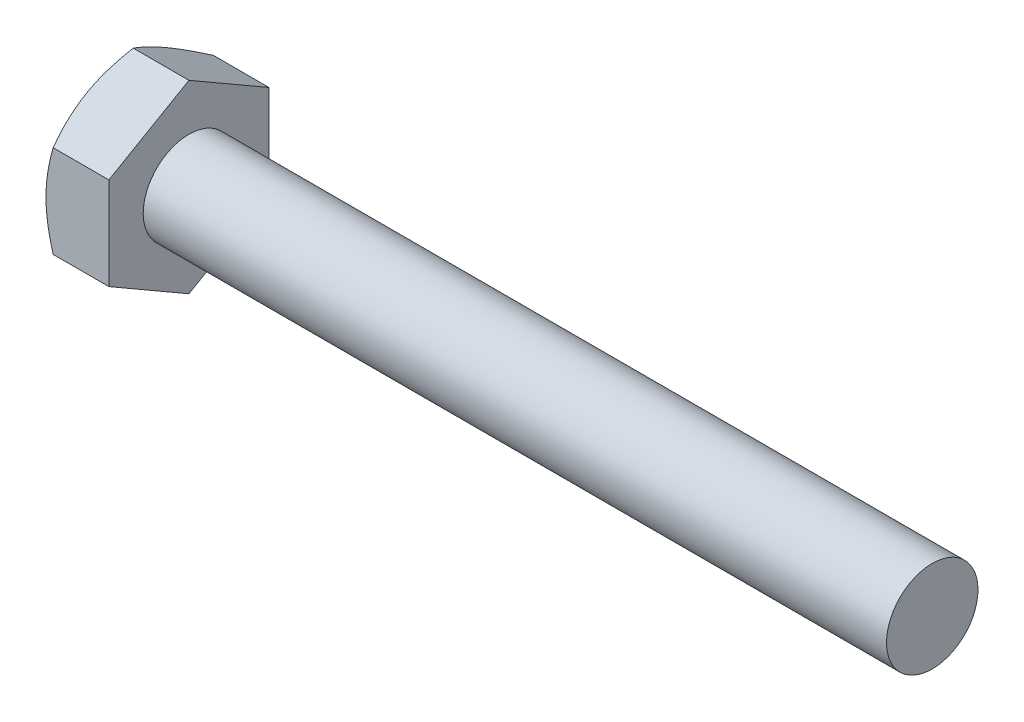
ISO-10303-21;
HEADER;
FILE_DESCRIPTION(('STEP AP214'),'2;1');
FILE_NAME('part.step','',(''),(''),'','','');
FILE_SCHEMA(('AUTOMOTIVE_DESIGN { 1 0 10303 214 1 1 1 1 }'));
ENDSEC;
DATA;
#1=APPLICATION_CONTEXT('core data for automotive mechanical design processes');
#2=APPLICATION_PROTOCOL_DEFINITION('international standard','automotive_design',2000,#1);
#3=PRODUCT_CONTEXT('',#1,'mechanical');
#4=PRODUCT('Part','Part','',(#3));
#5=PRODUCT_RELATED_PRODUCT_CATEGORY('part','',(#4));
#6=PRODUCT_DEFINITION_FORMATION('','',#4);
#7=PRODUCT_DEFINITION_CONTEXT('part definition',#1,'design');
#8=PRODUCT_DEFINITION('design','',#6,#7);
#9=PRODUCT_DEFINITION_SHAPE('','',#8);
#10=(LENGTH_UNIT() NAMED_UNIT(*) SI_UNIT(.MILLI.,.METRE.));
#11=(NAMED_UNIT(*) PLANE_ANGLE_UNIT() SI_UNIT($,.RADIAN.));
#12=(NAMED_UNIT(*) SI_UNIT($,.STERADIAN.) SOLID_ANGLE_UNIT());
#13=UNCERTAINTY_MEASURE_WITH_UNIT(LENGTH_MEASURE(1.E-05),#10,'distance_accuracy_value','');
#14=(GEOMETRIC_REPRESENTATION_CONTEXT(3) GLOBAL_UNCERTAINTY_ASSIGNED_CONTEXT((#13)) GLOBAL_UNIT_ASSIGNED_CONTEXT((#10,
#11,#12)) REPRESENTATION_CONTEXT('',''));
#15=CARTESIAN_POINT('',(0.,0.,0.));
#16=DIRECTION('',(0.,0.,1.));
#17=DIRECTION('',(1.,0.,0.));
#18=AXIS2_PLACEMENT_3D('',#15,#16,#17);
#19=CARTESIAN_POINT('',(-27.9796875,-3.20790243318486,5.55625));
#20=DIRECTION('',(0.,0.,-1.));
#21=DIRECTION('',(0.,1.,0.));
#22=AXIS2_PLACEMENT_3D('',#19,#20,#21);
#23=PLANE('',#22);
#24=CARTESIAN_POINT('',(-25.2062500574615,-8.74399028271725,5.55625));
#25=CARTESIAN_POINT('',(-25.3250226439003,-8.50018624433215,5.55625));
#26=CARTESIAN_POINT('',(-25.4426924877412,-8.25583594838019,5.55625));
#27=CARTESIAN_POINT('',(-25.6752088302931,-7.76575276181024,5.55625));
#28=CARTESIAN_POINT('',(-25.790054907504,-7.52001967143121,5.55625));
#29=CARTESIAN_POINT('',(-26.0168565650906,-7.02567502758555,5.55625));
#30=CARTESIAN_POINT('',(-26.1287940754759,-6.77705515601887,5.55625));
#31=CARTESIAN_POINT('',(-26.3482541438231,-6.27788161359692,5.55625));
#32=CARTESIAN_POINT('',(-26.455776902331,-6.02732803119865,5.55625));
#33=CARTESIAN_POINT('',(-26.668781896146,-5.51539046667092,5.55625));
#34=CARTESIAN_POINT('',(-26.7740727000269,-5.2539264127266,5.55625));
#35=CARTESIAN_POINT('',(-26.9769889851458,-4.72798657849262,5.55625));
#36=CARTESIAN_POINT('',(-27.0746136244234,-4.46351047103703,5.55625));
#37=CARTESIAN_POINT('',(-27.2597282154484,-3.931581690416,5.55625));
#38=CARTESIAN_POINT('',(-27.3472376154158,-3.66413585057299,5.55625));
#39=CARTESIAN_POINT('',(-27.5093974423586,-3.12540698347402,5.55625));
#40=CARTESIAN_POINT('',(-27.584051786064,-2.85412515234024,5.55625));
#41=CARTESIAN_POINT('',(-27.7166111578849,-2.30908269853906,5.55625));
#42=CARTESIAN_POINT('',(-27.7746096690236,-2.03534517245376,5.55625));
#43=CARTESIAN_POINT('',(-27.8706483322196,-1.48429809984413,5.55625));
#44=CARTESIAN_POINT('',(-27.9086906465641,-1.20698894364918,5.55625));
#45=CARTESIAN_POINT('',(-27.9482678026956,-0.791294728945898,5.55625));
#46=CARTESIAN_POINT('',(-27.958533902021,-0.653708209357044,5.55625));
#47=CARTESIAN_POINT('',(-27.973237187288,-0.378228688137566,5.55625));
#48=CARTESIAN_POINT('',(-27.9776749263983,-0.240335716836749,5.55625));
#49=CARTESIAN_POINT('',(-27.9806104775687,0.0355251316508488,5.55625));
#50=CARTESIAN_POINT('',(-27.9791077727923,0.17349301431098,5.55625));
#51=CARTESIAN_POINT('',(-27.9702015100424,0.449228447033497,5.55625));
#52=CARTESIAN_POINT('',(-27.9627981814189,0.586996004673769,5.55625));
#53=CARTESIAN_POINT('',(-27.9383619355163,0.914267817860302,5.55625));
#54=CARTESIAN_POINT('',(-27.9187422237309,1.10358331302688,5.55625));
#55=CARTESIAN_POINT('',(-27.8694018119308,1.48088314390515,5.55625));
#56=CARTESIAN_POINT('',(-27.8396798473206,1.66886730995275,5.55625));
#57=CARTESIAN_POINT('',(-27.7369305513119,2.23056094001761,5.55625));
#58=CARTESIAN_POINT('',(-27.6503356125147,2.60182550045217,5.55625));
#59=CARTESIAN_POINT('',(-27.4992011053987,3.15725729103479,5.55625));
#60=CARTESIAN_POINT('',(-27.4445336113424,3.34427702524158,5.55625));
#61=CARTESIAN_POINT('',(-27.329281052333,3.71650215163137,5.55625));
#62=CARTESIAN_POINT('',(-27.2686959419117,3.90170752986172,5.55625));
#63=CARTESIAN_POINT('',(-27.1426000457604,4.27035971442928,5.55625));
#64=CARTESIAN_POINT('',(-27.0770906550753,4.45380700235122,5.55625));
#65=CARTESIAN_POINT('',(-26.9419409129719,4.81916376783226,5.55625));
#66=CARTESIAN_POINT('',(-26.8723006552842,5.00107328017707,5.55625));
#67=CARTESIAN_POINT('',(-26.6799083948252,5.48965634412821,5.55625));
#68=CARTESIAN_POINT('',(-26.5539222750788,5.79505516029649,5.55625));
#69=CARTESIAN_POINT('',(-26.2945712832958,6.40271511827116,5.55625));
#70=CARTESIAN_POINT('',(-26.1612055993156,6.7049759104509,5.55625));
#71=CARTESIAN_POINT('',(-25.8888381126131,7.30707795631466,5.55625));
#72=CARTESIAN_POINT('',(-25.7498341769931,7.60691824193361,5.55625));
#73=CARTESIAN_POINT('',(-25.4675353632321,8.20455030388993,5.55625));
#74=CARTESIAN_POINT('',(-25.3242406584325,8.50234216238501,5.55625));
#75=CARTESIAN_POINT('',(-25.034062083384,9.09675870347432,5.55625));
#76=CARTESIAN_POINT('',(-24.8871728378226,9.39338075659061,5.55625));
#77=CARTESIAN_POINT('',(-24.5907164750758,9.98528417706331,5.55625));
#78=CARTESIAN_POINT('',(-24.4411493357868,10.2805655333282,5.55625));
#79=CARTESIAN_POINT('',(-23.9893144244542,11.1646418998589,5.55625));
#80=CARTESIAN_POINT('',(-23.6838479994491,11.7518013892495,5.55625));
#81=CARTESIAN_POINT('',(-23.0997429574185,12.8613257589912,5.55625));
#82=CARTESIAN_POINT('',(-22.8216735829024,13.3839917749348,5.55625));
#83=CARTESIAN_POINT('',(-22.2621764266466,14.4275635287064,5.55625));
#84=CARTESIAN_POINT('',(-21.9807484397935,14.9484691565073,5.55625));
#85=CARTESIAN_POINT('',(-21.4163519924016,15.9871873035495,5.55625));
#86=CARTESIAN_POINT('',(-21.1333918337456,16.5050043408021,5.55625));
#87=CARTESIAN_POINT('',(-20.5655648642822,17.5395393833806,5.55625));
#88=CARTESIAN_POINT('',(-20.2806982052306,18.0562574719669,5.55625));
#89=CARTESIAN_POINT('',(-19.99513735051,18.5725892213169,5.55624999999999));
#90=B_SPLINE_CURVE_WITH_KNOTS('',3,(#24,#25,#26,#27,#28,#29,#30,#31,#32,#33,#34,#35,#36,#37,#38,
#39,#40,#41,#42,#43,#44,#45,#46,#47,#48,#49,#50,#51,#52,#53,#54,#55,#56,#57,#58,#59,#60,#61,#62,
#63,#64,#65,#66,#67,#68,#69,#70,#71,#72,#73,#74,#75,#76,#77,#78,#79,#80,#81,#82,#83,#84,#85,#86,
#87,#88,#89),.UNSPECIFIED.,.F.,.F.,(4,2,2,2,2,2,2,2,2,2,2,2,2,2,2,2,2,2,2,2,2,2,2,2,2,2,2,2,2,2,
2,2,4),(0.,0.813597716445731,1.6273161491936,2.44525275827226,3.26315217028694,4.10866348233596,
4.95426752580813,5.79821771718856,6.64191031370899,7.48077064504382,8.31954006567861,
8.73334238532056,9.14710542821066,9.56090447051725,9.97468742974188,10.545356138106,
11.1160963088497,12.258134229421,12.842619474887,13.4271092116055,14.0114339823823,
14.5957454997084,15.5866951993033,16.5777541467498,17.5691915643883,18.5605889831377,
19.5535724737812,20.5465641644216,22.5321054869692,24.3081902186865,26.0843839782317,
27.8546363211013,29.6247493906644),.UNSPECIFIED.);
#91=CARTESIAN_POINT('',(-27.4834232665182,-3.20790243318486,5.55625));
#92=VERTEX_POINT('',#91);
#93=CARTESIAN_POINT('',(-27.9796875,0.,5.55625));
#94=VERTEX_POINT('',#93);
#95=EDGE_CURVE('E282',#92,#94,#90,.T.);
#96=ORIENTED_EDGE('',*,*,#95,.F.);
#97=DIRECTION('',(1.,0.,0.));
#98=VECTOR('',#97,1.);
#99=CARTESIAN_POINT('',(-27.9796875,-3.20790243318486,5.55625));
#100=LINE('',#99,#98);
#101=CARTESIAN_POINT('',(-23.6140625,-3.20790243318486,5.55625));
#102=VERTEX_POINT('',#101);
#103=EDGE_CURVE('E258',#92,#102,#100,.T.);
#104=ORIENTED_EDGE('',*,*,#103,.T.);
#105=DIRECTION('',(0.,1.,0.));
#106=VECTOR('',#105,1.);
#107=CARTESIAN_POINT('',(-23.6140625,-3.20790243318486,5.55625));
#108=LINE('',#107,#106);
#109=CARTESIAN_POINT('',(-23.6140625,3.20790243318486,5.55625));
#110=VERTEX_POINT('',#109);
#111=EDGE_CURVE('E279',#102,#110,#108,.T.);
#112=ORIENTED_EDGE('',*,*,#111,.T.);
#113=DIRECTION('',(1.,0.,0.));
#114=VECTOR('',#113,1.);
#115=CARTESIAN_POINT('',(-27.9796875,3.20790243318486,5.55625));
#116=LINE('',#115,#114);
#117=CARTESIAN_POINT('',(-27.4834232665182,3.20790243318486,5.55625));
#118=VERTEX_POINT('',#117);
#119=EDGE_CURVE('E242',#118,#110,#116,.T.);
#120=ORIENTED_EDGE('',*,*,#119,.F.);
#121=EDGE_CURVE('E123',#94,#118,#90,.T.);
#122=ORIENTED_EDGE('',*,*,#121,.F.);
#123=EDGE_LOOP('',(#96,#104,#112,#120,#122));
#124=FACE_BOUND('',#123,.T.);
#125=ADVANCED_FACE('F46',(#124),#23,.F.);
#126=CARTESIAN_POINT('',(-27.9796875,3.20790243318486,5.55625));
#127=DIRECTION('',(0.,-0.866025403784439,-0.5));
#128=DIRECTION('',(0.,0.5,-0.866025403784439));
#129=AXIS2_PLACEMENT_3D('',#126,#127,#128);
#130=PLANE('',#129);
#131=CARTESIAN_POINT('',(-27.4833565980518,3.20778696313102,5.55645));
#132=CARTESIAN_POINT('',(-27.5240619396287,3.27830048099898,5.43431700443227));
#133=CARTESIAN_POINT('',(-27.5629199606368,3.34907690760433,5.31172863757364));
#134=CARTESIAN_POINT('',(-27.6364325665754,3.49120454378004,5.06555635055764));
#135=CARTESIAN_POINT('',(-27.6710853381981,3.56255598725623,4.94197202526351));
#136=CARTESIAN_POINT('',(-27.7680556144389,3.7777527611819,4.56924027919934));
#137=CARTESIAN_POINT('',(-27.823211445498,3.92244755263586,4.3186215488105));
#138=CARTESIAN_POINT('',(-27.887888595153,4.13898067940738,3.94357517172046));
#139=CARTESIAN_POINT('',(-27.9063133296374,4.21017202280889,3.82026814788997));
#140=CARTESIAN_POINT('',(-27.9372091337596,4.35287639627881,3.57309692257778));
#141=CARTESIAN_POINT('',(-27.949680729438,4.42438939736052,3.44923277130254));
#142=CARTESIAN_POINT('',(-27.9683524134017,4.56753961185542,3.20128932668298));
#143=CARTESIAN_POINT('',(-27.9745596193166,4.63917659144933,3.07721043832556));
#144=CARTESIAN_POINT('',(-27.9805760825862,4.7825127822332,2.82894487332451));
#145=CARTESIAN_POINT('',(-27.9803855375727,4.85421199143242,2.70475820012895));
#146=CARTESIAN_POINT('',(-27.9710692573071,5.05064720059277,2.36452243746779));
#147=CARTESIAN_POINT('',(-27.9554278403106,5.1753189069971,2.14858470770919));
#148=CARTESIAN_POINT('',(-27.9058275950254,5.42383425573453,1.71814349723526));
#149=CARTESIAN_POINT('',(-27.8718518117333,5.54767702400135,1.50364153044716));
#150=CARTESIAN_POINT('',(-27.7869217499519,5.79669255822861,1.07233397329164));
#151=CARTESIAN_POINT('',(-27.7356076119579,5.92183390122649,0.855582809091897));
#152=CARTESIAN_POINT('',(-27.6191450447076,6.17025031750736,0.425312954659246));
#153=CARTESIAN_POINT('',(-27.5540239741206,6.29352857247572,0.21178875358562));
#154=CARTESIAN_POINT('',(-27.4833565980518,6.41592033642355,-0.000200000000002093));
#155=B_SPLINE_CURVE_WITH_KNOTS('',3,(#131,#132,#133,#134,#135,#136,#137,#138,#139,#140,#141,
#142,#143,#144,#145,#146,#147,#148,#149,#150,#151,#152,#153,#154),.UNSPECIFIED.,.F.,.F.,(4,2,2,
2,2,2,2,2,2,2,2,4),(0.,0.440316908268042,0.880823012040824,1.76366572331169,2.19427472390783,
2.62484566732156,3.05492684132792,3.48499472977669,4.23370964386675,4.98311813377593,
5.74914806559356,6.51367405016873),.UNSPECIFIED.);
#156=CARTESIAN_POINT('',(-27.9796875,4.81185364977729,2.778125));
#157=VERTEX_POINT('',#156);
#158=EDGE_CURVE('E119',#118,#157,#155,.T.);
#159=ORIENTED_EDGE('',*,*,#158,.F.);
#160=ORIENTED_EDGE('',*,*,#119,.T.);
#161=DIRECTION('',(0.,0.5,-0.866025403784439));
#162=VECTOR('',#161,1.);
#163=CARTESIAN_POINT('',(-23.6140625,3.20790243318486,5.55625));
#164=LINE('',#163,#162);
#165=CARTESIAN_POINT('',(-23.6140625,6.41580486636972,0.));
#166=VERTEX_POINT('',#165);
#167=EDGE_CURVE('E277',#110,#166,#164,.T.);
#168=ORIENTED_EDGE('',*,*,#167,.T.);
#169=DIRECTION('',(1.,0.,0.));
#170=VECTOR('',#169,1.);
#171=CARTESIAN_POINT('',(-27.9796875,6.41580486636972,0.));
#172=LINE('',#171,#170);
#173=CARTESIAN_POINT('',(-27.4834232665182,6.41580486636972,0.));
#174=VERTEX_POINT('',#173);
#175=EDGE_CURVE('E144',#174,#166,#172,.T.);
#176=ORIENTED_EDGE('',*,*,#175,.F.);
#177=EDGE_CURVE('E128',#157,#174,#155,.T.);
#178=ORIENTED_EDGE('',*,*,#177,.F.);
#179=EDGE_LOOP('',(#159,#160,#168,#176,#178));
#180=FACE_BOUND('',#179,.T.);
#181=ADVANCED_FACE('F142',(#180),#130,.F.);
#182=CARTESIAN_POINT('',(-27.9796875,6.41580486636972,0.));
#183=DIRECTION('',(0.,-0.866025403784439,0.5));
#184=DIRECTION('',(0.,-0.5,-0.866025403784439));
#185=AXIS2_PLACEMENT_3D('',#182,#183,#184);
#186=PLANE('',#185);
#187=CARTESIAN_POINT('',(-27.4833565980518,6.41592033642355,0.000199999999998099));
#188=CARTESIAN_POINT('',(-27.5240619396287,6.34540681855559,-0.121932995567732));
#189=CARTESIAN_POINT('',(-27.5629199606368,6.27463039195025,-0.244521362426355));
#190=CARTESIAN_POINT('',(-27.6364325665754,6.13250275577453,-0.490693649442358));
#191=CARTESIAN_POINT('',(-27.6710853381981,6.06115131229835,-0.614277974736489));
#192=CARTESIAN_POINT('',(-27.7680556144389,5.84595453837268,-0.987009720800664));
#193=CARTESIAN_POINT('',(-27.823211445498,5.70125974691872,-1.2376284511895));
#194=CARTESIAN_POINT('',(-27.887888595153,5.48472662014719,-1.61267482827954));
#195=CARTESIAN_POINT('',(-27.9063133296374,5.41353527674569,-1.73598185211002));
#196=CARTESIAN_POINT('',(-27.9372091337596,5.27083090327577,-1.98315307742222));
#197=CARTESIAN_POINT('',(-27.949680729438,5.19931790219406,-2.10701722869746));
#198=CARTESIAN_POINT('',(-27.9683524134017,5.05616768769916,-2.35496067331702));
#199=CARTESIAN_POINT('',(-27.9745596193166,4.98453070810525,-2.47903956167444));
#200=CARTESIAN_POINT('',(-27.9805760825862,4.84119451732138,-2.72730512667549));
#201=CARTESIAN_POINT('',(-27.9803855375727,4.76949530812216,-2.85149179987105));
#202=CARTESIAN_POINT('',(-27.9710692573071,4.5730600989618,-3.19172756253221));
#203=CARTESIAN_POINT('',(-27.9554278403106,4.44838839255747,-3.40766529229081));
#204=CARTESIAN_POINT('',(-27.9058275950254,4.19987304382004,-3.83810650276474));
#205=CARTESIAN_POINT('',(-27.8718518117333,4.07603027555323,-4.05260846955284));
#206=CARTESIAN_POINT('',(-27.7869217499519,3.82701474132597,-4.48391602670836));
#207=CARTESIAN_POINT('',(-27.7356076119579,3.70187339832808,-4.7006671909081));
#208=CARTESIAN_POINT('',(-27.6191450447076,3.45345698204721,-5.13093704534075));
#209=CARTESIAN_POINT('',(-27.5540239741206,3.33017872707885,-5.34446124641438));
#210=CARTESIAN_POINT('',(-27.4833565980518,3.20778696313102,-5.55645));
#211=B_SPLINE_CURVE_WITH_KNOTS('',3,(#187,#188,#189,#190,#191,#192,#193,#194,#195,#196,#197,
#198,#199,#200,#201,#202,#203,#204,#205,#206,#207,#208,#209,#210),.UNSPECIFIED.,.F.,.F.,(4,2,2,
2,2,2,2,2,2,2,2,4),(0.,0.440316908268041,0.880823012040823,1.76366572331169,2.19427472390783,
2.62484566732156,3.05492684132792,3.48499472977669,4.23370964386674,4.98311813377593,
5.74914806559356,6.51367405016872),.UNSPECIFIED.);
#212=CARTESIAN_POINT('',(-27.9796875,4.81185364977729,-2.778125));
#213=VERTEX_POINT('',#212);
#214=EDGE_CURVE('E133',#174,#213,#211,.T.);
#215=ORIENTED_EDGE('',*,*,#214,.F.);
#216=ORIENTED_EDGE('',*,*,#175,.T.);
#217=DIRECTION('',(0.,-0.5,-0.866025403784439));
#218=VECTOR('',#217,1.);
#219=CARTESIAN_POINT('',(-23.6140625,6.41580486636972,0.));
#220=LINE('',#219,#218);
#221=CARTESIAN_POINT('',(-23.6140625,3.20790243318486,-5.55625));
#222=VERTEX_POINT('',#221);
#223=EDGE_CURVE('E273',#166,#222,#220,.T.);
#224=ORIENTED_EDGE('',*,*,#223,.T.);
#225=DIRECTION('',(1.,0.,0.));
#226=VECTOR('',#225,1.);
#227=CARTESIAN_POINT('',(-27.9796875,3.20790243318486,-5.55625));
#228=LINE('',#227,#226);
#229=CARTESIAN_POINT('',(-27.4834232665182,3.20790243318486,-5.55625));
#230=VERTEX_POINT('',#229);
#231=EDGE_CURVE('E249',#230,#222,#228,.T.);
#232=ORIENTED_EDGE('',*,*,#231,.F.);
#233=EDGE_CURVE('E147',#213,#230,#211,.T.);
#234=ORIENTED_EDGE('',*,*,#233,.F.);
#235=EDGE_LOOP('',(#215,#216,#224,#232,#234));
#236=FACE_BOUND('',#235,.T.);
#237=ADVANCED_FACE('F208',(#236),#186,.F.);
#238=CARTESIAN_POINT('',(-27.9796875,3.20790243318486,-5.55625));
#239=DIRECTION('',(0.,0.,1.));
#240=DIRECTION('',(0.,-1.,0.));
#241=AXIS2_PLACEMENT_3D('',#238,#239,#240);
#242=PLANE('',#241);
#243=CARTESIAN_POINT('',(-25.2062500598475,-8.74399027782085,-5.55625));
#244=CARTESIAN_POINT('',(-25.3250226461868,-8.50018623960062,-5.55625));
#245=CARTESIAN_POINT('',(-25.4426924899284,-8.25583594381362,-5.55625));
#246=CARTESIAN_POINT('',(-25.675208832282,-7.76575275757412,-5.55625));
#247=CARTESIAN_POINT('',(-25.790054909394,-7.52001966736056,-5.55625));
#248=CARTESIAN_POINT('',(-26.0168565667827,-7.02567502384834,-5.55625));
#249=CARTESIAN_POINT('',(-26.1287940770691,-6.77705515244963,-5.55625));
#250=CARTESIAN_POINT('',(-26.3482541452201,-6.27788161036475,-5.55625));
#251=CARTESIAN_POINT('',(-26.4557769036307,-6.02732802813559,-5.55625));
#252=CARTESIAN_POINT('',(-26.6687818972481,-5.51539046395943,-5.55625));
#253=CARTESIAN_POINT('',(-26.774072701029,-5.25392641019769,-5.55625));
#254=CARTESIAN_POINT('',(-26.9769889859531,-4.72798657633179,-5.55625));
#255=CARTESIAN_POINT('',(-27.0746136251359,-4.4635104690617,-5.55625));
#256=CARTESIAN_POINT('',(-27.2597282159805,-3.93158168881508,-5.55625));
#257=CARTESIAN_POINT('',(-27.3472376158621,-3.66413584916098,-5.55625));
#258=CARTESIAN_POINT('',(-27.5093974426472,-3.12540698244496,-5.55625));
#259=CARTESIAN_POINT('',(-27.5840517862806,-2.8541251515052,-5.55625));
#260=CARTESIAN_POINT('',(-27.7166111579561,-2.30908269819076,-5.55625));
#261=CARTESIAN_POINT('',(-27.7746096690269,-2.03534517239951,-5.55625));
#262=CARTESIAN_POINT('',(-27.8706483321313,-1.4842981003853,-5.55625));
#263=CARTESIAN_POINT('',(-27.9086906464521,-1.20698894449172,-5.55625));
#264=CARTESIAN_POINT('',(-27.9482678025883,-0.791294730238443,-5.55625));
#265=CARTESIAN_POINT('',(-27.9585339019217,-0.653708210797409,-5.55625));
#266=CARTESIAN_POINT('',(-27.9732371872177,-0.378228689873304,-5.55625));
#267=CARTESIAN_POINT('',(-27.9776749263492,-0.240335718720041,-5.55625));
#268=CARTESIAN_POINT('',(-27.9806104775746,0.0355251294734925,-5.55625));
#269=CARTESIAN_POINT('',(-27.9791077728321,0.173493011987112,-5.55625));
#270=CARTESIAN_POINT('',(-27.970201510162,0.449228444418531,-5.55625));
#271=CARTESIAN_POINT('',(-27.9627981815845,0.586996001914216,-5.55625));
#272=CARTESIAN_POINT('',(-27.9383619357947,0.914267814878998,-5.55625));
#273=CARTESIAN_POINT('',(-27.9187422240741,1.10358330996903,-5.55625));
#274=CARTESIAN_POINT('',(-27.869401812407,1.48088314069774,-5.55625));
#275=CARTESIAN_POINT('',(-27.8396798478651,1.66886730667231,-5.55625));
#276=CARTESIAN_POINT('',(-27.7369305520625,2.23056093652212,-5.55625));
#277=CARTESIAN_POINT('',(-27.6503356134045,2.60182549681905,-5.55625));
#278=CARTESIAN_POINT('',(-27.4992011064939,3.15725728719582,-5.55625));
#279=CARTESIAN_POINT('',(-27.4445336125065,3.34427702133249,-5.55625));
#280=CARTESIAN_POINT('',(-27.3292810536328,3.71650214758286,-5.55625));
#281=CARTESIAN_POINT('',(-27.2686959432783,3.9017075257439,-5.55625));
#282=CARTESIAN_POINT('',(-27.142600047258,4.27035971017337,-5.55625));
#283=CARTESIAN_POINT('',(-27.0770906566373,4.45380699802653,-5.55625));
#284=CARTESIAN_POINT('',(-26.9419409146602,4.81916376337001,-5.55625));
#285=CARTESIAN_POINT('',(-26.8723006570347,5.00107327564603,-5.55625));
#286=CARTESIAN_POINT('',(-26.6799083966823,5.48965633955827,-5.55625));
#287=CARTESIAN_POINT('',(-26.5539222769738,5.7950551557544,-5.55625));
#288=CARTESIAN_POINT('',(-26.2945712852557,6.4027151137812,-5.55625));
#289=CARTESIAN_POINT('',(-26.1612056013023,6.7049759059852,-5.55625));
#290=CARTESIAN_POINT('',(-25.8888381146457,7.3070779518949,-5.55625));
#291=CARTESIAN_POINT('',(-25.7498341790448,7.60691823753553,-5.55625));
#292=CARTESIAN_POINT('',(-25.4675353653161,8.20455029953286,-5.55625));
#293=CARTESIAN_POINT('',(-25.3242406605298,8.50234215804726,-5.55625));
#294=CARTESIAN_POINT('',(-25.0340620855033,9.09675869917466,-5.55625));
#295=CARTESIAN_POINT('',(-24.8871728399505,9.3933807523097,-5.55625));
#296=CARTESIAN_POINT('',(-24.590716477218,9.98528417281851,-5.55625));
#297=CARTESIAN_POINT('',(-24.4411493379345,10.2805655291008,-5.55625));
#298=CARTESIAN_POINT('',(-23.9893144266152,11.1646418956815,-5.55625));
#299=CARTESIAN_POINT('',(-23.6838480016145,11.7518013851031,-5.55625));
#300=CARTESIAN_POINT('',(-23.0997429596005,12.8613257548756,-5.55625));
#301=CARTESIAN_POINT('',(-22.8216735850974,13.3839917708193,-5.55625));
#302=CARTESIAN_POINT('',(-22.262176428865,14.42756352459,-5.55625));
#303=CARTESIAN_POINT('',(-21.9807484420221,14.9484691523898,-5.55625000000001));
#304=CARTESIAN_POINT('',(-21.4163519946515,15.9871872994245,-5.55625000000001));
#305=CARTESIAN_POINT('',(-21.1333918360065,16.5050043366708,-5.55625000000001));
#306=CARTESIAN_POINT('',(-20.5655648665637,17.5395393792358,-5.55625000000001));
#307=CARTESIAN_POINT('',(-20.2806982075218,18.056257467815,-5.55625000000001));
#308=CARTESIAN_POINT('',(-19.9951373528106,18.5725892171576,-5.55625000000001));
#309=B_SPLINE_CURVE_WITH_KNOTS('',3,(#243,#244,#245,#246,#247,#248,#249,#250,#251,#252,#253,
#254,#255,#256,#257,#258,#259,#260,#261,#262,#263,#264,#265,#266,#267,#268,#269,#270,#271,#272,
#273,#274,#275,#276,#277,#278,#279,#280,#281,#282,#283,#284,#285,#286,#287,#288,#289,#290,#291,
#292,#293,#294,#295,#296,#297,#298,#299,#300,#301,#302,#303,#304,#305,#306,#307,#308),
.UNSPECIFIED.,.F.,.F.,(4,2,2,2,2,2,2,2,2,2,2,2,2,2,2,2,2,2,2,2,2,2,2,2,2,2,2,2,2,2,2,2,4),(0.,
0.813597715870463,1.62731614804298,2.4452527565403,3.26315216797367,4.10866347940255,
4.95426752225437,5.79821771301645,6.64191030891902,7.48077063935045,8.31954005908317,
8.73334237828504,9.14710542073519,9.56090446260155,9.97468742138601,10.5453561295019,
11.1160962999972,12.2581342200709,12.8426194652768,13.4271092017353,14.0114339722529,
14.5957454893196,15.5866951889479,16.5777541364282,17.5691915541016,18.5605889728859,
19.5535724635683,20.5465641542476,22.5321054768716,24.308190208571,26.0843839680985,
27.8546363109357,29.624749380466),.UNSPECIFIED.);
#310=CARTESIAN_POINT('',(-27.9796875,0.,-5.55625));
#311=VERTEX_POINT('',#310);
#312=EDGE_CURVE('E202',#230,#311,#309,.F.);
#313=ORIENTED_EDGE('',*,*,#312,.F.);
#314=ORIENTED_EDGE('',*,*,#231,.T.);
#315=DIRECTION('',(0.,-1.,0.));
#316=VECTOR('',#315,1.);
#317=CARTESIAN_POINT('',(-23.6140625,3.20790243318486,-5.55625));
#318=LINE('',#317,#316);
#319=CARTESIAN_POINT('',(-23.6140625,-3.20790243318486,-5.55625));
#320=VERTEX_POINT('',#319);
#321=EDGE_CURVE('E269',#222,#320,#318,.T.);
#322=ORIENTED_EDGE('',*,*,#321,.T.);
#323=DIRECTION('',(1.,0.,0.));
#324=VECTOR('',#323,1.);
#325=CARTESIAN_POINT('',(-27.9796875,-3.20790243318486,-5.55625));
#326=LINE('',#325,#324);
#327=CARTESIAN_POINT('',(-27.4834232665182,-3.20790243318486,-5.55625));
#328=VERTEX_POINT('',#327);
#329=EDGE_CURVE('E252',#328,#320,#326,.T.);
#330=ORIENTED_EDGE('',*,*,#329,.F.);
#331=EDGE_CURVE('E195',#311,#328,#309,.F.);
#332=ORIENTED_EDGE('',*,*,#331,.F.);
#333=EDGE_LOOP('',(#313,#314,#322,#330,#332));
#334=FACE_BOUND('',#333,.T.);
#335=ADVANCED_FACE('F204',(#334),#242,.F.);
#336=CARTESIAN_POINT('',(-27.9796875,-3.20790243318486,-5.55625));
#337=DIRECTION('',(0.,0.866025403784439,0.5));
#338=DIRECTION('',(0.,-0.5,0.866025403784439));
#339=AXIS2_PLACEMENT_3D('',#336,#337,#338);
#340=PLANE('',#339);
#341=CARTESIAN_POINT('',(-27.4833565980518,-3.20778696313102,-5.55645));
#342=CARTESIAN_POINT('',(-27.5240619396287,-3.27830048099899,-5.43431700443227));
#343=CARTESIAN_POINT('',(-27.5629199606368,-3.34907690760433,-5.31172863757365));
#344=CARTESIAN_POINT('',(-27.6364325665754,-3.49120454378004,-5.06555635055765));
#345=CARTESIAN_POINT('',(-27.6710853381981,-3.56255598725623,-4.94197202526351));
#346=CARTESIAN_POINT('',(-27.7680556144389,-3.7777527611819,-4.56924027919934));
#347=CARTESIAN_POINT('',(-27.823211445498,-3.92244755263586,-4.3186215488105));
#348=CARTESIAN_POINT('',(-27.887888595153,-4.13898067940738,-3.94357517172046));
#349=CARTESIAN_POINT('',(-27.9063133296374,-4.21017202280889,-3.82026814788998));
#350=CARTESIAN_POINT('',(-27.9372091337596,-4.35287639627881,-3.57309692257779));
#351=CARTESIAN_POINT('',(-27.949680729438,-4.42438939736052,-3.44923277130254));
#352=CARTESIAN_POINT('',(-27.9683524134017,-4.56753961185542,-3.20128932668298));
#353=CARTESIAN_POINT('',(-27.9745596193166,-4.63917659144933,-3.07721043832556));
#354=CARTESIAN_POINT('',(-27.9805760825862,-4.7825127822332,-2.82894487332451));
#355=CARTESIAN_POINT('',(-27.9803855375727,-4.85421199143242,-2.70475820012895));
#356=CARTESIAN_POINT('',(-27.9710692573071,-5.05064720059278,-2.36452243746779));
#357=CARTESIAN_POINT('',(-27.9554278403106,-5.1753189069971,-2.14858470770919));
#358=CARTESIAN_POINT('',(-27.9058275950254,-5.42383425573454,-1.71814349723526));
#359=CARTESIAN_POINT('',(-27.8718518117333,-5.54767702400135,-1.50364153044716));
#360=CARTESIAN_POINT('',(-27.7869217499519,-5.79669255822861,-1.07233397329164));
#361=CARTESIAN_POINT('',(-27.7356076119579,-5.92183390122649,-0.855582809091897));
#362=CARTESIAN_POINT('',(-27.6191450447076,-6.17025031750737,-0.425312954659246));
#363=CARTESIAN_POINT('',(-27.5540239741206,-6.29352857247572,-0.21178875358562));
#364=CARTESIAN_POINT('',(-27.4833565980518,-6.41592033642356,0.000200000000000821));
#365=B_SPLINE_CURVE_WITH_KNOTS('',3,(#341,#342,#343,#344,#345,#346,#347,#348,#349,#350,#351,
#352,#353,#354,#355,#356,#357,#358,#359,#360,#361,#362,#363,#364),.UNSPECIFIED.,.F.,.F.,(4,2,2,
2,2,2,2,2,2,2,2,4),(0.,0.44031690826804,0.880823012040824,1.76366572331169,2.19427472390783,
2.62484566732156,3.05492684132792,3.4849947297767,4.23370964386675,4.98311813377593,
5.74914806559357,6.51367405016873),.UNSPECIFIED.);
#366=CARTESIAN_POINT('',(-27.9796875,-4.81185364977729,-2.778125));
#367=VERTEX_POINT('',#366);
#368=EDGE_CURVE('E203',#328,#367,#365,.T.);
#369=ORIENTED_EDGE('',*,*,#368,.F.);
#370=ORIENTED_EDGE('',*,*,#329,.T.);
#371=DIRECTION('',(0.,-0.5,0.866025403784439));
#372=VECTOR('',#371,1.);
#373=CARTESIAN_POINT('',(-23.6140625,-3.20790243318486,-5.55625));
#374=LINE('',#373,#372);
#375=CARTESIAN_POINT('',(-23.6140625,-6.41580486636972,0.));
#376=VERTEX_POINT('',#375);
#377=EDGE_CURVE('E265',#320,#376,#374,.T.);
#378=ORIENTED_EDGE('',*,*,#377,.T.);
#379=DIRECTION('',(1.,0.,0.));
#380=VECTOR('',#379,1.);
#381=CARTESIAN_POINT('',(-27.9796875,-6.41580486636972,0.));
#382=LINE('',#381,#380);
#383=CARTESIAN_POINT('',(-27.4834232665182,-6.41580486636972,0.));
#384=VERTEX_POINT('',#383);
#385=EDGE_CURVE('E255',#384,#376,#382,.T.);
#386=ORIENTED_EDGE('',*,*,#385,.F.);
#387=EDGE_CURVE('E189',#367,#384,#365,.T.);
#388=ORIENTED_EDGE('',*,*,#387,.F.);
#389=EDGE_LOOP('',(#369,#370,#378,#386,#388));
#390=FACE_BOUND('',#389,.T.);
#391=ADVANCED_FACE('F207',(#390),#340,.F.);
#392=CARTESIAN_POINT('',(-27.9796875,-6.41580486636972,0.));
#393=DIRECTION('',(0.,0.866025403784439,-0.5));
#394=DIRECTION('',(0.,0.5,0.866025403784439));
#395=AXIS2_PLACEMENT_3D('',#392,#393,#394);
#396=PLANE('',#395);
#397=CARTESIAN_POINT('',(-27.4833565980518,-6.41592033642356,-0.000199999999999715));
#398=CARTESIAN_POINT('',(-27.5240619396287,-6.34540681855559,0.121932995567731));
#399=CARTESIAN_POINT('',(-27.5629199606368,-6.27463039195025,0.244521362426353));
#400=CARTESIAN_POINT('',(-27.6364325665754,-6.13250275577454,0.490693649442356));
#401=CARTESIAN_POINT('',(-27.6710853381981,-6.06115131229835,0.614277974736487));
#402=CARTESIAN_POINT('',(-27.7680556144389,-5.84595453837268,0.987009720800662));
#403=CARTESIAN_POINT('',(-27.823211445498,-5.70125974691872,1.2376284511895));
#404=CARTESIAN_POINT('',(-27.887888595153,-5.48472662014719,1.61267482827954));
#405=CARTESIAN_POINT('',(-27.9063133296374,-5.41353527674569,1.73598185211002));
#406=CARTESIAN_POINT('',(-27.9372091337596,-5.27083090327577,1.98315307742222));
#407=CARTESIAN_POINT('',(-27.949680729438,-5.19931790219406,2.10701722869746));
#408=CARTESIAN_POINT('',(-27.9683524134017,-5.05616768769916,2.35496067331702));
#409=CARTESIAN_POINT('',(-27.9745596193166,-4.98453070810525,2.47903956167444));
#410=CARTESIAN_POINT('',(-27.9805760825862,-4.84119451732138,2.72730512667549));
#411=CARTESIAN_POINT('',(-27.9803855375727,-4.76949530812216,2.85149179987105));
#412=CARTESIAN_POINT('',(-27.9710692573071,-4.5730600989618,3.19172756253221));
#413=CARTESIAN_POINT('',(-27.9554278403106,-4.44838839255747,3.40766529229081));
#414=CARTESIAN_POINT('',(-27.9058275950254,-4.19987304382004,3.83810650276474));
#415=CARTESIAN_POINT('',(-27.8718518117333,-4.07603027555323,4.05260846955284));
#416=CARTESIAN_POINT('',(-27.7869217499519,-3.82701474132597,4.48391602670836));
#417=CARTESIAN_POINT('',(-27.7356076119579,-3.70187339832808,4.7006671909081));
#418=CARTESIAN_POINT('',(-27.6191450447076,-3.45345698204721,5.13093704534075));
#419=CARTESIAN_POINT('',(-27.5540239741206,-3.33017872707885,5.34446124641438));
#420=CARTESIAN_POINT('',(-27.4833565980518,-3.20778696313102,5.55645));
#421=B_SPLINE_CURVE_WITH_KNOTS('',3,(#397,#398,#399,#400,#401,#402,#403,#404,#405,#406,#407,
#408,#409,#410,#411,#412,#413,#414,#415,#416,#417,#418,#419,#420),.UNSPECIFIED.,.F.,.F.,(4,2,2,
2,2,2,2,2,2,2,2,4),(0.,0.440316908268041,0.880823012040823,1.76366572331169,2.19427472390783,
2.62484566732156,3.05492684132792,3.4849947297767,4.23370964386675,4.98311813377593,
5.74914806559356,6.51367405016873),.UNSPECIFIED.);
#422=CARTESIAN_POINT('',(-27.9796875,-4.81185364977729,2.778125));
#423=VERTEX_POINT('',#422);
#424=EDGE_CURVE('E317',#384,#423,#421,.T.);
#425=ORIENTED_EDGE('',*,*,#424,.F.);
#426=ORIENTED_EDGE('',*,*,#385,.T.);
#427=DIRECTION('',(0.,0.5,0.866025403784439));
#428=VECTOR('',#427,1.);
#429=CARTESIAN_POINT('',(-23.6140625,-6.41580486636972,0.));
#430=LINE('',#429,#428);
#431=EDGE_CURVE('E261',#376,#102,#430,.T.);
#432=ORIENTED_EDGE('',*,*,#431,.T.);
#433=ORIENTED_EDGE('',*,*,#103,.F.);
#434=EDGE_CURVE('E139',#423,#92,#421,.T.);
#435=ORIENTED_EDGE('',*,*,#434,.F.);
#436=EDGE_LOOP('',(#425,#426,#432,#433,#435));
#437=FACE_BOUND('',#436,.T.);
#438=ADVANCED_FACE('F231',(#437),#396,.F.);
#439=CARTESIAN_POINT('',(-23.6140625,0.,0.));
#440=DIRECTION('',(1.,0.,0.));
#441=DIRECTION('',(0.,0.,-1.));
#442=AXIS2_PLACEMENT_3D('',#439,#440,#441);
#443=CYLINDRICAL_SURFACE('',#442,3.175);
#444=CARTESIAN_POINT('',(-23.6140625,0.,0.));
#445=DIRECTION('',(-1.,0.,0.));
#446=DIRECTION('',(0.,0.,1.));
#447=AXIS2_PLACEMENT_3D('',#444,#445,#446);
#448=CIRCLE('',#447,3.175);
#449=CARTESIAN_POINT('',(-23.6140625,0.,3.175));
#450=VERTEX_POINT('',#449);
#451=EDGE_CURVE('E238',#450,#450,#448,.F.);
#452=ORIENTED_EDGE('',*,*,#451,.T.);
#453=EDGE_LOOP('',(#452));
#454=FACE_BOUND('',#453,.T.);
#455=CARTESIAN_POINT('',(27.9796875,0.,0.));
#456=DIRECTION('',(1.,0.,0.));
#457=DIRECTION('',(0.,0.,-1.));
#458=AXIS2_PLACEMENT_3D('',#455,#456,#457);
#459=CIRCLE('',#458,3.175);
#460=CARTESIAN_POINT('',(27.9796875,0.,-3.175));
#461=VERTEX_POINT('',#460);
#462=EDGE_CURVE('E235',#461,#461,#459,.T.);
#463=ORIENTED_EDGE('',*,*,#462,.F.);
#464=EDGE_LOOP('',(#463));
#465=FACE_BOUND('',#464,.T.);
#466=ADVANCED_FACE('F48',(#454,#465),#443,.T.);
#467=CARTESIAN_POINT('',(27.9796875,0.,0.));
#468=DIRECTION('',(1.,0.,0.));
#469=DIRECTION('',(0.,0.,-1.));
#470=AXIS2_PLACEMENT_3D('',#467,#468,#469);
#471=PLANE('',#470);
#472=ORIENTED_EDGE('',*,*,#462,.T.);
#473=EDGE_LOOP('',(#472));
#474=FACE_BOUND('',#473,.T.);
#475=ADVANCED_FACE('F224',(#474),#471,.T.);
#476=CARTESIAN_POINT('',(-23.6140625,3.20790243318486,5.55625));
#477=DIRECTION('',(-1.,0.,0.));
#478=DIRECTION('',(0.,0.,1.));
#479=AXIS2_PLACEMENT_3D('',#476,#477,#478);
#480=PLANE('',#479);
#481=ORIENTED_EDGE('',*,*,#451,.F.);
#482=EDGE_LOOP('',(#481));
#483=FACE_BOUND('',#482,.T.);
#484=ORIENTED_EDGE('',*,*,#111,.F.);
#485=ORIENTED_EDGE('',*,*,#431,.F.);
#486=ORIENTED_EDGE('',*,*,#377,.F.);
#487=ORIENTED_EDGE('',*,*,#321,.F.);
#488=ORIENTED_EDGE('',*,*,#223,.F.);
#489=ORIENTED_EDGE('',*,*,#167,.F.);
#490=EDGE_LOOP('',(#484,#485,#486,#487,#488,#489));
#491=FACE_BOUND('',#490,.T.);
#492=ADVANCED_FACE('F174',(#483,#491),#480,.F.);
#493=CARTESIAN_POINT('',(-27.9796875,0.,0.));
#494=DIRECTION('',(1.,0.,0.));
#495=DIRECTION('',(0.,0.,1.));
#496=AXIS2_PLACEMENT_3D('',#493,#494,#495);
#497=CONICAL_SURFACE('',#496,5.55625,1.0471975511966);
#498=ORIENTED_EDGE('',*,*,#95,.T.);
#499=CARTESIAN_POINT('',(-27.9796875,0.,0.));
#500=DIRECTION('',(-1.,0.,0.));
#501=DIRECTION('',(0.,0.,1.));
#502=AXIS2_PLACEMENT_3D('',#499,#500,#501);
#503=CIRCLE('',#502,5.55625);
#504=EDGE_CURVE('E50',#423,#94,#503,.T.);
#505=ORIENTED_EDGE('',*,*,#504,.F.);
#506=ORIENTED_EDGE('',*,*,#434,.T.);
#507=EDGE_LOOP('',(#498,#505,#506));
#508=FACE_BOUND('',#507,.T.);
#509=ADVANCED_FACE('F169',(#508),#497,.T.);
#510=ORIENTED_EDGE('',*,*,#387,.T.);
#511=ORIENTED_EDGE('',*,*,#424,.T.);
#512=EDGE_CURVE('E71',#367,#423,#503,.T.);
#513=ORIENTED_EDGE('',*,*,#512,.F.);
#514=EDGE_LOOP('',(#510,#511,#513));
#515=FACE_BOUND('',#514,.T.);
#516=ADVANCED_FACE('F173',(#515),#497,.T.);
#517=ORIENTED_EDGE('',*,*,#331,.T.);
#518=ORIENTED_EDGE('',*,*,#368,.T.);
#519=EDGE_CURVE('E307',#311,#367,#503,.T.);
#520=ORIENTED_EDGE('',*,*,#519,.F.);
#521=EDGE_LOOP('',(#517,#518,#520));
#522=FACE_BOUND('',#521,.T.);
#523=ADVANCED_FACE('F308',(#522),#497,.T.);
#524=ORIENTED_EDGE('',*,*,#233,.T.);
#525=ORIENTED_EDGE('',*,*,#312,.T.);
#526=EDGE_CURVE('E56',#213,#311,#503,.T.);
#527=ORIENTED_EDGE('',*,*,#526,.F.);
#528=EDGE_LOOP('',(#524,#525,#527));
#529=FACE_BOUND('',#528,.T.);
#530=ADVANCED_FACE('F304',(#529),#497,.T.);
#531=ORIENTED_EDGE('',*,*,#177,.T.);
#532=ORIENTED_EDGE('',*,*,#214,.T.);
#533=EDGE_CURVE('E12',#157,#213,#503,.T.);
#534=ORIENTED_EDGE('',*,*,#533,.F.);
#535=EDGE_LOOP('',(#531,#532,#534));
#536=FACE_BOUND('',#535,.T.);
#537=ADVANCED_FACE('F131',(#536),#497,.T.);
#538=ORIENTED_EDGE('',*,*,#121,.T.);
#539=ORIENTED_EDGE('',*,*,#158,.T.);
#540=CARTESIAN_POINT('',(-27.9796875,0.,0.));
#541=DIRECTION('',(-1.,0.,0.));
#542=DIRECTION('',(0.,0.,1.));
#543=AXIS2_PLACEMENT_3D('',#540,#541,#542);
#544=CIRCLE('',#543,5.55625);
#545=EDGE_CURVE('E63',#94,#157,#544,.T.);
#546=ORIENTED_EDGE('',*,*,#545,.F.);
#547=EDGE_LOOP('',(#538,#539,#546));
#548=FACE_BOUND('',#547,.T.);
#549=ADVANCED_FACE('F121',(#548),#497,.T.);
#550=CARTESIAN_POINT('',(-27.9796875,3.20790243318486,5.55625));
#551=DIRECTION('',(-1.,0.,0.));
#552=DIRECTION('',(0.,0.,1.));
#553=AXIS2_PLACEMENT_3D('',#550,#551,#552);
#554=PLANE('',#553);
#555=ORIENTED_EDGE('',*,*,#504,.T.);
#556=ORIENTED_EDGE('',*,*,#545,.T.);
#557=ORIENTED_EDGE('',*,*,#533,.T.);
#558=ORIENTED_EDGE('',*,*,#526,.T.);
#559=ORIENTED_EDGE('',*,*,#519,.T.);
#560=ORIENTED_EDGE('',*,*,#512,.T.);
#561=EDGE_LOOP('',(#555,#556,#557,#558,#559,#560));
#562=FACE_BOUND('',#561,.T.);
#563=ADVANCED_FACE('F137',(#562),#554,.T.);
#564=CLOSED_SHELL('',(#125,#181,#237,#335,#391,#438,#466,#475,#492,#509,#516,#523,#530,#537,
#549,#563));
#565=MANIFOLD_SOLID_BREP('B2',#564);
#566=ADVANCED_BREP_SHAPE_REPRESENTATION('',(#18,#565),#14);
#567=SHAPE_DEFINITION_REPRESENTATION(#9,#566);
ENDSEC;
END-ISO-10303-21;
